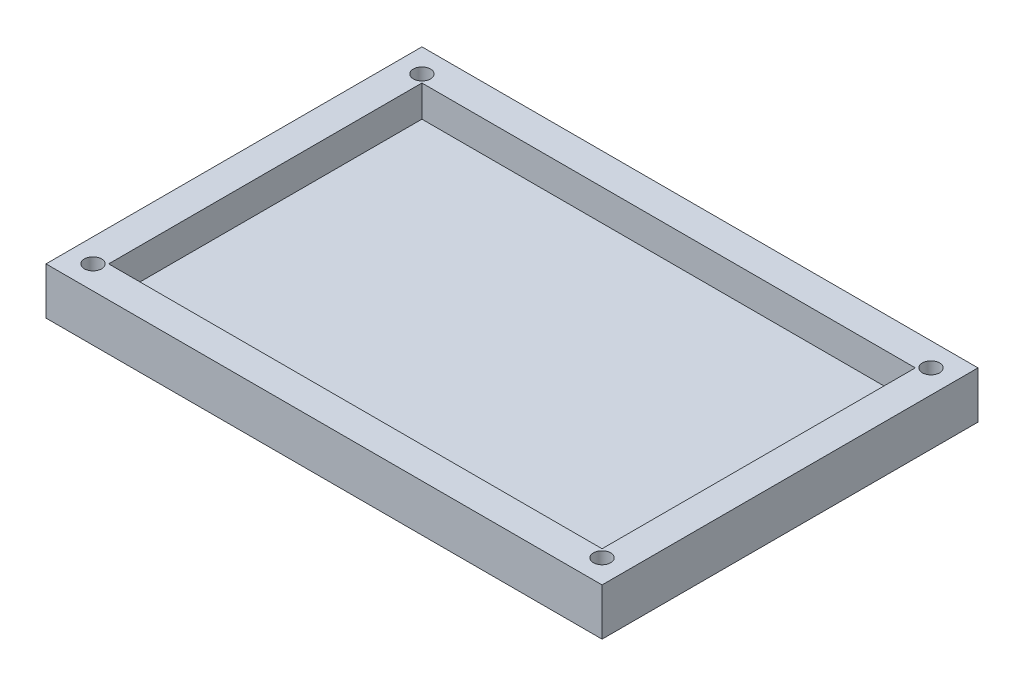
ISO-10303-21;
HEADER;
FILE_DESCRIPTION(('STEP AP214'),'2;1');
FILE_NAME('part.step','',(''),(''),'','','');
FILE_SCHEMA(('AUTOMOTIVE_DESIGN { 1 0 10303 214 1 1 1 1 }'));
ENDSEC;
DATA;
#1=APPLICATION_CONTEXT('core data for automotive mechanical design processes');
#2=APPLICATION_PROTOCOL_DEFINITION('international standard','automotive_design',2000,#1);
#3=PRODUCT_CONTEXT('',#1,'mechanical');
#4=PRODUCT('Part','Part','',(#3));
#5=PRODUCT_RELATED_PRODUCT_CATEGORY('part','',(#4));
#6=PRODUCT_DEFINITION_FORMATION('','',#4);
#7=PRODUCT_DEFINITION_CONTEXT('part definition',#1,'design');
#8=PRODUCT_DEFINITION('design','',#6,#7);
#9=PRODUCT_DEFINITION_SHAPE('','',#8);
#10=(LENGTH_UNIT() NAMED_UNIT(*) SI_UNIT(.MILLI.,.METRE.));
#11=(NAMED_UNIT(*) PLANE_ANGLE_UNIT() SI_UNIT($,.RADIAN.));
#12=(NAMED_UNIT(*) SI_UNIT($,.STERADIAN.) SOLID_ANGLE_UNIT());
#13=UNCERTAINTY_MEASURE_WITH_UNIT(LENGTH_MEASURE(1.E-05),#10,'distance_accuracy_value','');
#14=(GEOMETRIC_REPRESENTATION_CONTEXT(3) GLOBAL_UNCERTAINTY_ASSIGNED_CONTEXT((#13)) GLOBAL_UNIT_ASSIGNED_CONTEXT((#10,
#11,#12)) REPRESENTATION_CONTEXT('',''));
#15=CARTESIAN_POINT('',(0.,0.,0.));
#16=DIRECTION('',(0.,0.,1.));
#17=DIRECTION('',(1.,0.,0.));
#18=AXIS2_PLACEMENT_3D('',#15,#16,#17);
#19=CARTESIAN_POINT('',(17.75,3.,-12.));
#20=DIRECTION('',(-1.,0.,0.));
#21=DIRECTION('',(0.,0.,1.));
#22=AXIS2_PLACEMENT_3D('',#19,#20,#21);
#23=PLANE('',#22);
#24=DIRECTION('',(0.,0.,-1.));
#25=VECTOR('',#24,1.);
#26=CARTESIAN_POINT('',(17.75,0.,-12.));
#27=LINE('',#26,#25);
#28=CARTESIAN_POINT('',(17.75,0.,12.));
#29=VERTEX_POINT('',#28);
#30=CARTESIAN_POINT('',(17.75,0.,-12.));
#31=VERTEX_POINT('',#30);
#32=EDGE_CURVE('E162',#29,#31,#27,.T.);
#33=ORIENTED_EDGE('',*,*,#32,.T.);
#34=DIRECTION('',(0.,-1.,0.));
#35=VECTOR('',#34,1.);
#36=CARTESIAN_POINT('',(17.75,3.,-12.));
#37=LINE('',#36,#35);
#38=CARTESIAN_POINT('',(17.75,3.,-12.));
#39=VERTEX_POINT('',#38);
#40=EDGE_CURVE('E11',#39,#31,#37,.T.);
#41=ORIENTED_EDGE('',*,*,#40,.F.);
#42=DIRECTION('',(0.,0.,-1.));
#43=VECTOR('',#42,1.);
#44=CARTESIAN_POINT('',(17.75,3.,-12.));
#45=LINE('',#44,#43);
#46=CARTESIAN_POINT('',(17.75,3.,12.));
#47=VERTEX_POINT('',#46);
#48=EDGE_CURVE('E168',#47,#39,#45,.T.);
#49=ORIENTED_EDGE('',*,*,#48,.F.);
#50=DIRECTION('',(0.,-1.,0.));
#51=VECTOR('',#50,1.);
#52=CARTESIAN_POINT('',(17.75,3.,12.));
#53=LINE('',#52,#51);
#54=EDGE_CURVE('E178',#47,#29,#53,.T.);
#55=ORIENTED_EDGE('',*,*,#54,.T.);
#56=EDGE_LOOP('',(#33,#41,#49,#55));
#57=FACE_BOUND('',#56,.T.);
#58=ADVANCED_FACE('F39',(#57),#23,.F.);
#59=CARTESIAN_POINT('',(-17.75,3.,-12.));
#60=DIRECTION('',(0.,0.,1.));
#61=DIRECTION('',(1.,0.,0.));
#62=AXIS2_PLACEMENT_3D('',#59,#60,#61);
#63=PLANE('',#62);
#64=DIRECTION('',(-1.,0.,0.));
#65=VECTOR('',#64,1.);
#66=CARTESIAN_POINT('',(-17.75,0.,-12.));
#67=LINE('',#66,#65);
#68=CARTESIAN_POINT('',(-17.75,0.,-12.));
#69=VERTEX_POINT('',#68);
#70=EDGE_CURVE('E182',#31,#69,#67,.T.);
#71=ORIENTED_EDGE('',*,*,#70,.T.);
#72=DIRECTION('',(0.,-1.,0.));
#73=VECTOR('',#72,1.);
#74=CARTESIAN_POINT('',(-17.75,3.,-12.));
#75=LINE('',#74,#73);
#76=CARTESIAN_POINT('',(-17.75,3.,-12.));
#77=VERTEX_POINT('',#76);
#78=EDGE_CURVE('E47',#77,#69,#75,.T.);
#79=ORIENTED_EDGE('',*,*,#78,.F.);
#80=DIRECTION('',(-1.,0.,0.));
#81=VECTOR('',#80,1.);
#82=CARTESIAN_POINT('',(-17.75,3.,-12.));
#83=LINE('',#82,#81);
#84=EDGE_CURVE('E91',#39,#77,#83,.T.);
#85=ORIENTED_EDGE('',*,*,#84,.F.);
#86=ORIENTED_EDGE('',*,*,#40,.T.);
#87=EDGE_LOOP('',(#71,#79,#85,#86));
#88=FACE_BOUND('',#87,.T.);
#89=ADVANCED_FACE('F217',(#88),#63,.F.);
#90=CARTESIAN_POINT('',(-17.75,3.,-12.));
#91=DIRECTION('',(1.,0.,0.));
#92=DIRECTION('',(0.,0.,-1.));
#93=AXIS2_PLACEMENT_3D('',#90,#91,#92);
#94=PLANE('',#93);
#95=DIRECTION('',(0.,0.,1.));
#96=VECTOR('',#95,1.);
#97=CARTESIAN_POINT('',(-17.75,0.,-12.));
#98=LINE('',#97,#96);
#99=CARTESIAN_POINT('',(-17.75,0.,12.));
#100=VERTEX_POINT('',#99);
#101=EDGE_CURVE('E185',#69,#100,#98,.T.);
#102=ORIENTED_EDGE('',*,*,#101,.T.);
#103=DIRECTION('',(0.,-1.,0.));
#104=VECTOR('',#103,1.);
#105=CARTESIAN_POINT('',(-17.75,3.,12.));
#106=LINE('',#105,#104);
#107=CARTESIAN_POINT('',(-17.75,3.,12.));
#108=VERTEX_POINT('',#107);
#109=EDGE_CURVE('E192',#108,#100,#106,.T.);
#110=ORIENTED_EDGE('',*,*,#109,.F.);
#111=DIRECTION('',(0.,0.,1.));
#112=VECTOR('',#111,1.);
#113=CARTESIAN_POINT('',(-17.75,3.,-12.));
#114=LINE('',#113,#112);
#115=EDGE_CURVE('E173',#77,#108,#114,.T.);
#116=ORIENTED_EDGE('',*,*,#115,.F.);
#117=ORIENTED_EDGE('',*,*,#78,.T.);
#118=EDGE_LOOP('',(#102,#110,#116,#117));
#119=FACE_BOUND('',#118,.T.);
#120=ADVANCED_FACE('F199',(#119),#94,.F.);
#121=CARTESIAN_POINT('',(-17.75,3.,12.));
#122=DIRECTION('',(0.,0.,-1.));
#123=DIRECTION('',(-1.,0.,0.));
#124=AXIS2_PLACEMENT_3D('',#121,#122,#123);
#125=PLANE('',#124);
#126=DIRECTION('',(1.,0.,0.));
#127=VECTOR('',#126,1.);
#128=CARTESIAN_POINT('',(-17.75,0.,12.));
#129=LINE('',#128,#127);
#130=EDGE_CURVE('E84',#100,#29,#129,.T.);
#131=ORIENTED_EDGE('',*,*,#130,.T.);
#132=ORIENTED_EDGE('',*,*,#54,.F.);
#133=DIRECTION('',(1.,0.,0.));
#134=VECTOR('',#133,1.);
#135=CARTESIAN_POINT('',(-17.75,3.,12.));
#136=LINE('',#135,#134);
#137=EDGE_CURVE('E63',#108,#47,#136,.T.);
#138=ORIENTED_EDGE('',*,*,#137,.F.);
#139=ORIENTED_EDGE('',*,*,#109,.T.);
#140=EDGE_LOOP('',(#131,#132,#138,#139));
#141=FACE_BOUND('',#140,.T.);
#142=ADVANCED_FACE('F207',(#141),#125,.F.);
#143=CARTESIAN_POINT('',(0.,3.,0.));
#144=DIRECTION('',(0.,1.,0.));
#145=DIRECTION('',(0.,0.,1.));
#146=AXIS2_PLACEMENT_3D('',#143,#144,#145);
#147=PLANE('',#146);
#148=CARTESIAN_POINT('',(16.25,3.,-10.5));
#149=DIRECTION('',(0.,1.,0.));
#150=DIRECTION('',(0.,0.,1.));
#151=AXIS2_PLACEMENT_3D('',#148,#149,#150);
#152=CIRCLE('',#151,0.55);
#153=CARTESIAN_POINT('',(16.25,3.,-9.95));
#154=VERTEX_POINT('',#153);
#155=EDGE_CURVE('E380',#154,#154,#152,.T.);
#156=ORIENTED_EDGE('',*,*,#155,.F.);
#157=EDGE_LOOP('',(#156));
#158=FACE_BOUND('',#157,.T.);
#159=CARTESIAN_POINT('',(16.25,3.,10.5));
#160=DIRECTION('',(0.,1.,0.));
#161=DIRECTION('',(0.,0.,1.));
#162=AXIS2_PLACEMENT_3D('',#159,#160,#161);
#163=CIRCLE('',#162,0.55);
#164=CARTESIAN_POINT('',(16.25,3.,11.05));
#165=VERTEX_POINT('',#164);
#166=EDGE_CURVE('E379',#165,#165,#163,.T.);
#167=ORIENTED_EDGE('',*,*,#166,.F.);
#168=EDGE_LOOP('',(#167));
#169=FACE_BOUND('',#168,.T.);
#170=CARTESIAN_POINT('',(-16.25,3.,10.5));
#171=DIRECTION('',(0.,1.,0.));
#172=DIRECTION('',(0.,0.,1.));
#173=AXIS2_PLACEMENT_3D('',#170,#171,#172);
#174=CIRCLE('',#173,0.55);
#175=CARTESIAN_POINT('',(-16.25,3.,11.05));
#176=VERTEX_POINT('',#175);
#177=EDGE_CURVE('E400',#176,#176,#174,.T.);
#178=ORIENTED_EDGE('',*,*,#177,.F.);
#179=EDGE_LOOP('',(#178));
#180=FACE_BOUND('',#179,.T.);
#181=CARTESIAN_POINT('',(-16.25,3.,-10.5));
#182=DIRECTION('',(0.,1.,0.));
#183=DIRECTION('',(0.,0.,1.));
#184=AXIS2_PLACEMENT_3D('',#181,#182,#183);
#185=CIRCLE('',#184,0.55);
#186=CARTESIAN_POINT('',(-16.25,3.,-9.95));
#187=VERTEX_POINT('',#186);
#188=EDGE_CURVE('E143',#187,#187,#185,.T.);
#189=ORIENTED_EDGE('',*,*,#188,.F.);
#190=EDGE_LOOP('',(#189));
#191=FACE_BOUND('',#190,.T.);
#192=DIRECTION('',(0.,0.,-1.));
#193=VECTOR('',#192,1.);
#194=CARTESIAN_POINT('',(15.75,3.,-10.));
#195=LINE('',#194,#193);
#196=CARTESIAN_POINT('',(15.75,3.,10.));
#197=VERTEX_POINT('',#196);
#198=CARTESIAN_POINT('',(15.75,3.,-10.));
#199=VERTEX_POINT('',#198);
#200=EDGE_CURVE('E54',#197,#199,#195,.T.);
#201=ORIENTED_EDGE('',*,*,#200,.F.);
#202=DIRECTION('',(1.,0.,0.));
#203=VECTOR('',#202,1.);
#204=CARTESIAN_POINT('',(-15.75,3.,10.));
#205=LINE('',#204,#203);
#206=CARTESIAN_POINT('',(-15.75,3.,10.));
#207=VERTEX_POINT('',#206);
#208=EDGE_CURVE('E136',#207,#197,#205,.T.);
#209=ORIENTED_EDGE('',*,*,#208,.F.);
#210=DIRECTION('',(0.,0.,1.));
#211=VECTOR('',#210,1.);
#212=CARTESIAN_POINT('',(-15.75,3.,-10.));
#213=LINE('',#212,#211);
#214=CARTESIAN_POINT('',(-15.75,3.,-10.));
#215=VERTEX_POINT('',#214);
#216=EDGE_CURVE('E140',#215,#207,#213,.T.);
#217=ORIENTED_EDGE('',*,*,#216,.F.);
#218=DIRECTION('',(-1.,0.,0.));
#219=VECTOR('',#218,1.);
#220=CARTESIAN_POINT('',(-15.75,3.,-10.));
#221=LINE('',#220,#219);
#222=EDGE_CURVE('E152',#199,#215,#221,.T.);
#223=ORIENTED_EDGE('',*,*,#222,.F.);
#224=EDGE_LOOP('',(#201,#209,#217,#223));
#225=FACE_BOUND('',#224,.T.);
#226=ORIENTED_EDGE('',*,*,#48,.T.);
#227=ORIENTED_EDGE('',*,*,#84,.T.);
#228=ORIENTED_EDGE('',*,*,#115,.T.);
#229=ORIENTED_EDGE('',*,*,#137,.T.);
#230=EDGE_LOOP('',(#226,#227,#228,#229));
#231=FACE_BOUND('',#230,.T.);
#232=ADVANCED_FACE('F209',(#158,#169,#180,#191,#225,#231),#147,.T.);
#233=CARTESIAN_POINT('',(0.,0.,0.));
#234=DIRECTION('',(0.,1.,0.));
#235=DIRECTION('',(0.,0.,1.));
#236=AXIS2_PLACEMENT_3D('',#233,#234,#235);
#237=PLANE('',#236);
#238=ORIENTED_EDGE('',*,*,#32,.F.);
#239=ORIENTED_EDGE('',*,*,#130,.F.);
#240=ORIENTED_EDGE('',*,*,#101,.F.);
#241=ORIENTED_EDGE('',*,*,#70,.F.);
#242=EDGE_LOOP('',(#238,#239,#240,#241));
#243=FACE_BOUND('',#242,.T.);
#244=ADVANCED_FACE('F203',(#243),#237,.F.);
#245=CARTESIAN_POINT('',(15.75,1.,-10.));
#246=DIRECTION('',(1.,0.,0.));
#247=DIRECTION('',(0.,0.,-1.));
#248=AXIS2_PLACEMENT_3D('',#245,#246,#247);
#249=PLANE('',#248);
#250=ORIENTED_EDGE('',*,*,#200,.T.);
#251=DIRECTION('',(0.,1.,0.));
#252=VECTOR('',#251,1.);
#253=CARTESIAN_POINT('',(15.75,1.,-10.));
#254=LINE('',#253,#252);
#255=CARTESIAN_POINT('',(15.75,1.,-10.));
#256=VERTEX_POINT('',#255);
#257=EDGE_CURVE('E111',#256,#199,#254,.T.);
#258=ORIENTED_EDGE('',*,*,#257,.F.);
#259=DIRECTION('',(0.,0.,-1.));
#260=VECTOR('',#259,1.);
#261=CARTESIAN_POINT('',(15.75,1.,-10.));
#262=LINE('',#261,#260);
#263=CARTESIAN_POINT('',(15.75,1.,10.));
#264=VERTEX_POINT('',#263);
#265=EDGE_CURVE('E115',#264,#256,#262,.T.);
#266=ORIENTED_EDGE('',*,*,#265,.F.);
#267=DIRECTION('',(0.,1.,0.));
#268=VECTOR('',#267,1.);
#269=CARTESIAN_POINT('',(15.75,1.,10.));
#270=LINE('',#269,#268);
#271=EDGE_CURVE('E159',#264,#197,#270,.T.);
#272=ORIENTED_EDGE('',*,*,#271,.T.);
#273=EDGE_LOOP('',(#250,#258,#266,#272));
#274=FACE_BOUND('',#273,.T.);
#275=ADVANCED_FACE('F113',(#274),#249,.F.);
#276=CARTESIAN_POINT('',(-15.75,1.,10.));
#277=DIRECTION('',(0.,0.,1.));
#278=DIRECTION('',(1.,0.,0.));
#279=AXIS2_PLACEMENT_3D('',#276,#277,#278);
#280=PLANE('',#279);
#281=ORIENTED_EDGE('',*,*,#208,.T.);
#282=ORIENTED_EDGE('',*,*,#271,.F.);
#283=DIRECTION('',(1.,0.,0.));
#284=VECTOR('',#283,1.);
#285=CARTESIAN_POINT('',(-15.75,1.,10.));
#286=LINE('',#285,#284);
#287=CARTESIAN_POINT('',(-15.75,1.,10.));
#288=VERTEX_POINT('',#287);
#289=EDGE_CURVE('E122',#288,#264,#286,.T.);
#290=ORIENTED_EDGE('',*,*,#289,.F.);
#291=DIRECTION('',(0.,1.,0.));
#292=VECTOR('',#291,1.);
#293=CARTESIAN_POINT('',(-15.75,1.,10.));
#294=LINE('',#293,#292);
#295=EDGE_CURVE('E163',#288,#207,#294,.T.);
#296=ORIENTED_EDGE('',*,*,#295,.T.);
#297=EDGE_LOOP('',(#281,#282,#290,#296));
#298=FACE_BOUND('',#297,.T.);
#299=ADVANCED_FACE('F251',(#298),#280,.F.);
#300=CARTESIAN_POINT('',(-15.75,1.,-10.));
#301=DIRECTION('',(-1.,0.,0.));
#302=DIRECTION('',(0.,0.,1.));
#303=AXIS2_PLACEMENT_3D('',#300,#301,#302);
#304=PLANE('',#303);
#305=ORIENTED_EDGE('',*,*,#216,.T.);
#306=ORIENTED_EDGE('',*,*,#295,.F.);
#307=DIRECTION('',(0.,0.,1.));
#308=VECTOR('',#307,1.);
#309=CARTESIAN_POINT('',(-15.75,1.,-10.));
#310=LINE('',#309,#308);
#311=CARTESIAN_POINT('',(-15.75,1.,-10.));
#312=VERTEX_POINT('',#311);
#313=EDGE_CURVE('E131',#312,#288,#310,.T.);
#314=ORIENTED_EDGE('',*,*,#313,.F.);
#315=DIRECTION('',(0.,1.,0.));
#316=VECTOR('',#315,1.);
#317=CARTESIAN_POINT('',(-15.75,1.,-10.));
#318=LINE('',#317,#316);
#319=EDGE_CURVE('E121',#312,#215,#318,.T.);
#320=ORIENTED_EDGE('',*,*,#319,.T.);
#321=EDGE_LOOP('',(#305,#306,#314,#320));
#322=FACE_BOUND('',#321,.T.);
#323=ADVANCED_FACE('F260',(#322),#304,.F.);
#324=CARTESIAN_POINT('',(-15.75,1.,-10.));
#325=DIRECTION('',(0.,0.,-1.));
#326=DIRECTION('',(-1.,0.,0.));
#327=AXIS2_PLACEMENT_3D('',#324,#325,#326);
#328=PLANE('',#327);
#329=ORIENTED_EDGE('',*,*,#222,.T.);
#330=ORIENTED_EDGE('',*,*,#319,.F.);
#331=DIRECTION('',(-1.,0.,0.));
#332=VECTOR('',#331,1.);
#333=CARTESIAN_POINT('',(-15.75,1.,-10.));
#334=LINE('',#333,#332);
#335=EDGE_CURVE('E125',#256,#312,#334,.T.);
#336=ORIENTED_EDGE('',*,*,#335,.F.);
#337=ORIENTED_EDGE('',*,*,#257,.T.);
#338=EDGE_LOOP('',(#329,#330,#336,#337));
#339=FACE_BOUND('',#338,.T.);
#340=ADVANCED_FACE('F126',(#339),#328,.F.);
#341=CARTESIAN_POINT('',(0.,1.,0.));
#342=DIRECTION('',(0.,1.,0.));
#343=DIRECTION('',(0.,0.,1.));
#344=AXIS2_PLACEMENT_3D('',#341,#342,#343);
#345=PLANE('',#344);
#346=ORIENTED_EDGE('',*,*,#265,.T.);
#347=ORIENTED_EDGE('',*,*,#335,.T.);
#348=ORIENTED_EDGE('',*,*,#313,.T.);
#349=ORIENTED_EDGE('',*,*,#289,.T.);
#350=EDGE_LOOP('',(#346,#347,#348,#349));
#351=FACE_BOUND('',#350,.T.);
#352=ADVANCED_FACE('F133',(#351),#345,.T.);
#353=CARTESIAN_POINT('',(-16.25,1.,-10.5));
#354=DIRECTION('',(0.,1.,0.));
#355=DIRECTION('',(0.,0.,1.));
#356=AXIS2_PLACEMENT_3D('',#353,#354,#355);
#357=CYLINDRICAL_SURFACE('',#356,0.55);
#358=CARTESIAN_POINT('',(-16.25,1.,-10.5));
#359=DIRECTION('',(0.,1.,0.));
#360=DIRECTION('',(0.,0.,1.));
#361=AXIS2_PLACEMENT_3D('',#358,#359,#360);
#362=CIRCLE('',#361,0.55);
#363=CARTESIAN_POINT('',(-16.25,1.,-9.95));
#364=VERTEX_POINT('',#363);
#365=EDGE_CURVE('E153',#364,#364,#362,.T.);
#366=ORIENTED_EDGE('',*,*,#365,.F.);
#367=EDGE_LOOP('',(#366));
#368=FACE_BOUND('',#367,.T.);
#369=ORIENTED_EDGE('',*,*,#188,.T.);
#370=EDGE_LOOP('',(#369));
#371=FACE_BOUND('',#370,.T.);
#372=ADVANCED_FACE('F287',(#368,#371),#357,.F.);
#373=CARTESIAN_POINT('',(-16.25,1.,-10.5));
#374=DIRECTION('',(0.,1.,0.));
#375=DIRECTION('',(0.,0.,1.));
#376=AXIS2_PLACEMENT_3D('',#373,#374,#375);
#377=PLANE('',#376);
#378=ORIENTED_EDGE('',*,*,#365,.T.);
#379=EDGE_LOOP('',(#378));
#380=FACE_BOUND('',#379,.T.);
#381=ADVANCED_FACE('F301',(#380),#377,.T.);
#382=CARTESIAN_POINT('',(-16.25,1.,10.5));
#383=DIRECTION('',(0.,1.,0.));
#384=DIRECTION('',(0.,0.,1.));
#385=AXIS2_PLACEMENT_3D('',#382,#383,#384);
#386=CYLINDRICAL_SURFACE('',#385,0.55);
#387=CARTESIAN_POINT('',(-16.25,1.,10.5));
#388=DIRECTION('',(0.,1.,0.));
#389=DIRECTION('',(0.,0.,1.));
#390=AXIS2_PLACEMENT_3D('',#387,#388,#389);
#391=CIRCLE('',#390,0.55);
#392=CARTESIAN_POINT('',(-16.25,1.,11.05));
#393=VERTEX_POINT('',#392);
#394=EDGE_CURVE('E395',#393,#393,#391,.T.);
#395=ORIENTED_EDGE('',*,*,#394,.F.);
#396=EDGE_LOOP('',(#395));
#397=FACE_BOUND('',#396,.T.);
#398=ORIENTED_EDGE('',*,*,#177,.T.);
#399=EDGE_LOOP('',(#398));
#400=FACE_BOUND('',#399,.T.);
#401=ADVANCED_FACE('F311',(#397,#400),#386,.F.);
#402=CARTESIAN_POINT('',(-16.25,1.,10.5));
#403=DIRECTION('',(0.,1.,0.));
#404=DIRECTION('',(0.,0.,1.));
#405=AXIS2_PLACEMENT_3D('',#402,#403,#404);
#406=PLANE('',#405);
#407=ORIENTED_EDGE('',*,*,#394,.T.);
#408=EDGE_LOOP('',(#407));
#409=FACE_BOUND('',#408,.T.);
#410=ADVANCED_FACE('F321',(#409),#406,.T.);
#411=CARTESIAN_POINT('',(16.25,1.,10.5));
#412=DIRECTION('',(0.,1.,0.));
#413=DIRECTION('',(0.,0.,1.));
#414=AXIS2_PLACEMENT_3D('',#411,#412,#413);
#415=CYLINDRICAL_SURFACE('',#414,0.55);
#416=CARTESIAN_POINT('',(16.25,1.,10.5));
#417=DIRECTION('',(0.,1.,0.));
#418=DIRECTION('',(0.,0.,1.));
#419=AXIS2_PLACEMENT_3D('',#416,#417,#418);
#420=CIRCLE('',#419,0.55);
#421=CARTESIAN_POINT('',(16.25,1.,11.05));
#422=VERTEX_POINT('',#421);
#423=EDGE_CURVE('E385',#422,#422,#420,.T.);
#424=ORIENTED_EDGE('',*,*,#423,.F.);
#425=EDGE_LOOP('',(#424));
#426=FACE_BOUND('',#425,.T.);
#427=ORIENTED_EDGE('',*,*,#166,.T.);
#428=EDGE_LOOP('',(#427));
#429=FACE_BOUND('',#428,.T.);
#430=ADVANCED_FACE('F331',(#426,#429),#415,.F.);
#431=CARTESIAN_POINT('',(16.25,1.,10.5));
#432=DIRECTION('',(0.,1.,0.));
#433=DIRECTION('',(0.,0.,1.));
#434=AXIS2_PLACEMENT_3D('',#431,#432,#433);
#435=PLANE('',#434);
#436=ORIENTED_EDGE('',*,*,#423,.T.);
#437=EDGE_LOOP('',(#436));
#438=FACE_BOUND('',#437,.T.);
#439=ADVANCED_FACE('F341',(#438),#435,.T.);
#440=CARTESIAN_POINT('',(16.25,1.,-10.5));
#441=DIRECTION('',(0.,1.,0.));
#442=DIRECTION('',(0.,0.,1.));
#443=AXIS2_PLACEMENT_3D('',#440,#441,#442);
#444=CYLINDRICAL_SURFACE('',#443,0.55);
#445=CARTESIAN_POINT('',(16.25,1.,-10.5));
#446=DIRECTION('',(0.,1.,0.));
#447=DIRECTION('',(0.,0.,1.));
#448=AXIS2_PLACEMENT_3D('',#445,#446,#447);
#449=CIRCLE('',#448,0.55);
#450=CARTESIAN_POINT('',(16.25,1.,-9.95));
#451=VERTEX_POINT('',#450);
#452=EDGE_CURVE('E377',#451,#451,#449,.T.);
#453=ORIENTED_EDGE('',*,*,#452,.F.);
#454=EDGE_LOOP('',(#453));
#455=FACE_BOUND('',#454,.T.);
#456=ORIENTED_EDGE('',*,*,#155,.T.);
#457=EDGE_LOOP('',(#456));
#458=FACE_BOUND('',#457,.T.);
#459=ADVANCED_FACE('F351',(#455,#458),#444,.F.);
#460=CARTESIAN_POINT('',(16.25,1.,-10.5));
#461=DIRECTION('',(0.,1.,0.));
#462=DIRECTION('',(0.,0.,1.));
#463=AXIS2_PLACEMENT_3D('',#460,#461,#462);
#464=PLANE('',#463);
#465=ORIENTED_EDGE('',*,*,#452,.T.);
#466=EDGE_LOOP('',(#465));
#467=FACE_BOUND('',#466,.T.);
#468=ADVANCED_FACE('F361',(#467),#464,.T.);
#469=CLOSED_SHELL('',(#58,#89,#120,#142,#232,#244,#275,#299,#323,#340,#352,#372,#381,#401,#410,
#430,#439,#459,#468));
#470=MANIFOLD_SOLID_BREP('B2',#469);
#471=ADVANCED_BREP_SHAPE_REPRESENTATION('',(#18,#470),#14);
#472=SHAPE_DEFINITION_REPRESENTATION(#9,#471);
ENDSEC;
END-ISO-10303-21;
